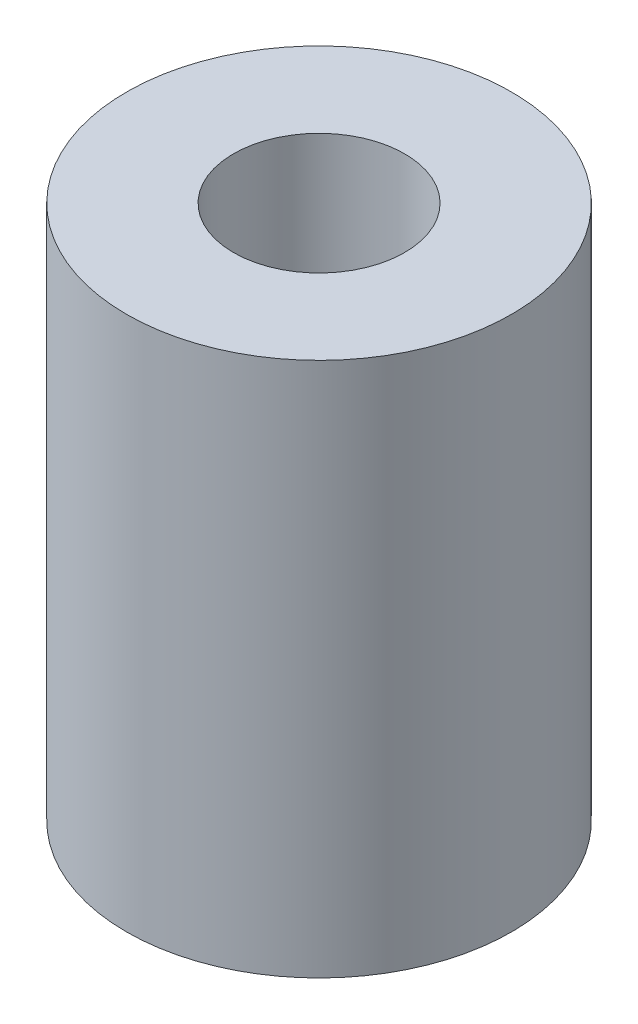
ISO-10303-21;
HEADER;
FILE_DESCRIPTION(('STEP AP214'),'2;1');
FILE_NAME('part.step','',(''),(''),'','','');
FILE_SCHEMA(('AUTOMOTIVE_DESIGN { 1 0 10303 214 1 1 1 1 }'));
ENDSEC;
DATA;
#1=APPLICATION_CONTEXT('core data for automotive mechanical design processes');
#2=APPLICATION_PROTOCOL_DEFINITION('international standard','automotive_design',2000,#1);
#3=PRODUCT_CONTEXT('',#1,'mechanical');
#4=PRODUCT('Part','Part','',(#3));
#5=PRODUCT_RELATED_PRODUCT_CATEGORY('part','',(#4));
#6=PRODUCT_DEFINITION_FORMATION('','',#4);
#7=PRODUCT_DEFINITION_CONTEXT('part definition',#1,'design');
#8=PRODUCT_DEFINITION('design','',#6,#7);
#9=PRODUCT_DEFINITION_SHAPE('','',#8);
#10=(LENGTH_UNIT() NAMED_UNIT(*) SI_UNIT(.MILLI.,.METRE.));
#11=(NAMED_UNIT(*) PLANE_ANGLE_UNIT() SI_UNIT($,.RADIAN.));
#12=(NAMED_UNIT(*) SI_UNIT($,.STERADIAN.) SOLID_ANGLE_UNIT());
#13=UNCERTAINTY_MEASURE_WITH_UNIT(LENGTH_MEASURE(1.E-05),#10,'distance_accuracy_value','');
#14=(GEOMETRIC_REPRESENTATION_CONTEXT(3) GLOBAL_UNCERTAINTY_ASSIGNED_CONTEXT((#13)) GLOBAL_UNIT_ASSIGNED_CONTEXT((#10,
#11,#12)) REPRESENTATION_CONTEXT('',''));
#15=CARTESIAN_POINT('',(0.,0.,0.));
#16=DIRECTION('',(0.,0.,1.));
#17=DIRECTION('',(1.,0.,0.));
#18=AXIS2_PLACEMENT_3D('',#15,#16,#17);
#19=CARTESIAN_POINT('',(0.,25.,0.));
#20=DIRECTION('',(0.,-1.,0.));
#21=DIRECTION('',(0.,0.,-1.));
#22=AXIS2_PLACEMENT_3D('',#19,#20,#21);
#23=CYLINDRICAL_SURFACE('',#22,2.5);
#24=CARTESIAN_POINT('',(0.,0.,0.));
#25=DIRECTION('',(0.,1.,0.));
#26=DIRECTION('',(0.,0.,1.));
#27=AXIS2_PLACEMENT_3D('',#24,#25,#26);
#28=CIRCLE('',#27,2.5);
#29=CARTESIAN_POINT('',(0.,0.,2.5));
#30=VERTEX_POINT('',#29);
#31=EDGE_CURVE('E45',#30,#30,#28,.T.);
#32=ORIENTED_EDGE('',*,*,#31,.F.);
#33=EDGE_LOOP('',(#32));
#34=FACE_BOUND('',#33,.T.);
#35=CARTESIAN_POINT('',(0.,15.,0.));
#36=DIRECTION('',(0.,1.,0.));
#37=DIRECTION('',(0.,0.,1.));
#38=AXIS2_PLACEMENT_3D('',#35,#36,#37);
#39=CIRCLE('',#38,2.5);
#40=CARTESIAN_POINT('',(0.,15.,2.5));
#41=VERTEX_POINT('',#40);
#42=EDGE_CURVE('E36',#41,#41,#39,.T.);
#43=ORIENTED_EDGE('',*,*,#42,.T.);
#44=EDGE_LOOP('',(#43));
#45=FACE_BOUND('',#44,.T.);
#46=ADVANCED_FACE('F32',(#34,#45),#23,.F.);
#47=CARTESIAN_POINT('',(0.,25.,0.));
#48=DIRECTION('',(0.,1.,0.));
#49=DIRECTION('',(0.,0.,1.));
#50=AXIS2_PLACEMENT_3D('',#47,#48,#49);
#51=PLANE('',#50);
#52=CARTESIAN_POINT('',(0.,25.,0.));
#53=DIRECTION('',(0.,1.,0.));
#54=DIRECTION('',(0.,0.,1.));
#55=AXIS2_PLACEMENT_3D('',#52,#53,#54);
#56=CIRCLE('',#55,4.);
#57=CARTESIAN_POINT('',(0.,25.,4.));
#58=VERTEX_POINT('',#57);
#59=EDGE_CURVE('E49',#58,#58,#56,.T.);
#60=ORIENTED_EDGE('',*,*,#59,.F.);
#61=EDGE_LOOP('',(#60));
#62=FACE_BOUND('',#61,.T.);
#63=CARTESIAN_POINT('',(0.,25.,0.));
#64=DIRECTION('',(0.,1.,0.));
#65=DIRECTION('',(0.,0.,1.));
#66=AXIS2_PLACEMENT_3D('',#63,#64,#65);
#67=CIRCLE('',#66,9.);
#68=CARTESIAN_POINT('',(0.,25.,9.));
#69=VERTEX_POINT('',#68);
#70=EDGE_CURVE('E10',#69,#69,#67,.T.);
#71=ORIENTED_EDGE('',*,*,#70,.T.);
#72=EDGE_LOOP('',(#71));
#73=FACE_BOUND('',#72,.T.);
#74=ADVANCED_FACE('F70',(#62,#73),#51,.T.);
#75=CARTESIAN_POINT('',(0.,0.,0.));
#76=DIRECTION('',(0.,1.,0.));
#77=DIRECTION('',(0.,0.,1.));
#78=AXIS2_PLACEMENT_3D('',#75,#76,#77);
#79=PLANE('',#78);
#80=CARTESIAN_POINT('',(0.,0.,0.));
#81=DIRECTION('',(0.,1.,0.));
#82=DIRECTION('',(0.,0.,1.));
#83=AXIS2_PLACEMENT_3D('',#80,#81,#82);
#84=CIRCLE('',#83,9.);
#85=CARTESIAN_POINT('',(0.,0.,9.));
#86=VERTEX_POINT('',#85);
#87=EDGE_CURVE('E40',#86,#86,#84,.T.);
#88=ORIENTED_EDGE('',*,*,#87,.F.);
#89=EDGE_LOOP('',(#88));
#90=FACE_BOUND('',#89,.T.);
#91=ORIENTED_EDGE('',*,*,#31,.T.);
#92=EDGE_LOOP('',(#91));
#93=FACE_BOUND('',#92,.T.);
#94=ADVANCED_FACE('F76',(#90,#93),#79,.F.);
#95=CARTESIAN_POINT('',(0.,25.,0.));
#96=DIRECTION('',(0.,-1.,0.));
#97=DIRECTION('',(0.,0.,-1.));
#98=AXIS2_PLACEMENT_3D('',#95,#96,#97);
#99=CYLINDRICAL_SURFACE('',#98,9.);
#100=ORIENTED_EDGE('',*,*,#70,.F.);
#101=EDGE_LOOP('',(#100));
#102=FACE_BOUND('',#101,.T.);
#103=ORIENTED_EDGE('',*,*,#87,.T.);
#104=EDGE_LOOP('',(#103));
#105=FACE_BOUND('',#104,.T.);
#106=ADVANCED_FACE('F34',(#102,#105),#99,.T.);
#107=CARTESIAN_POINT('',(0.,15.,0.));
#108=DIRECTION('',(0.,1.,0.));
#109=DIRECTION('',(0.,0.,1.));
#110=AXIS2_PLACEMENT_3D('',#107,#108,#109);
#111=CYLINDRICAL_SURFACE('',#110,4.);
#112=CARTESIAN_POINT('',(0.,15.,0.));
#113=DIRECTION('',(0.,1.,0.));
#114=DIRECTION('',(0.,0.,1.));
#115=AXIS2_PLACEMENT_3D('',#112,#113,#114);
#116=CIRCLE('',#115,4.);
#117=CARTESIAN_POINT('',(0.,15.,4.));
#118=VERTEX_POINT('',#117);
#119=EDGE_CURVE('E52',#118,#118,#116,.T.);
#120=ORIENTED_EDGE('',*,*,#119,.F.);
#121=EDGE_LOOP('',(#120));
#122=FACE_BOUND('',#121,.T.);
#123=ORIENTED_EDGE('',*,*,#59,.T.);
#124=EDGE_LOOP('',(#123));
#125=FACE_BOUND('',#124,.T.);
#126=ADVANCED_FACE('F62',(#122,#125),#111,.F.);
#127=CARTESIAN_POINT('',(0.,15.,0.));
#128=DIRECTION('',(0.,1.,0.));
#129=DIRECTION('',(0.,0.,1.));
#130=AXIS2_PLACEMENT_3D('',#127,#128,#129);
#131=PLANE('',#130);
#132=ORIENTED_EDGE('',*,*,#42,.F.);
#133=EDGE_LOOP('',(#132));
#134=FACE_BOUND('',#133,.T.);
#135=ORIENTED_EDGE('',*,*,#119,.T.);
#136=EDGE_LOOP('',(#135));
#137=FACE_BOUND('',#136,.T.);
#138=ADVANCED_FACE('F60',(#134,#137),#131,.T.);
#139=CLOSED_SHELL('',(#46,#74,#94,#106,#126,#138));
#140=MANIFOLD_SOLID_BREP('B2',#139);
#141=ADVANCED_BREP_SHAPE_REPRESENTATION('',(#18,#140),#14);
#142=SHAPE_DEFINITION_REPRESENTATION(#9,#141);
ENDSEC;
END-ISO-10303-21;
